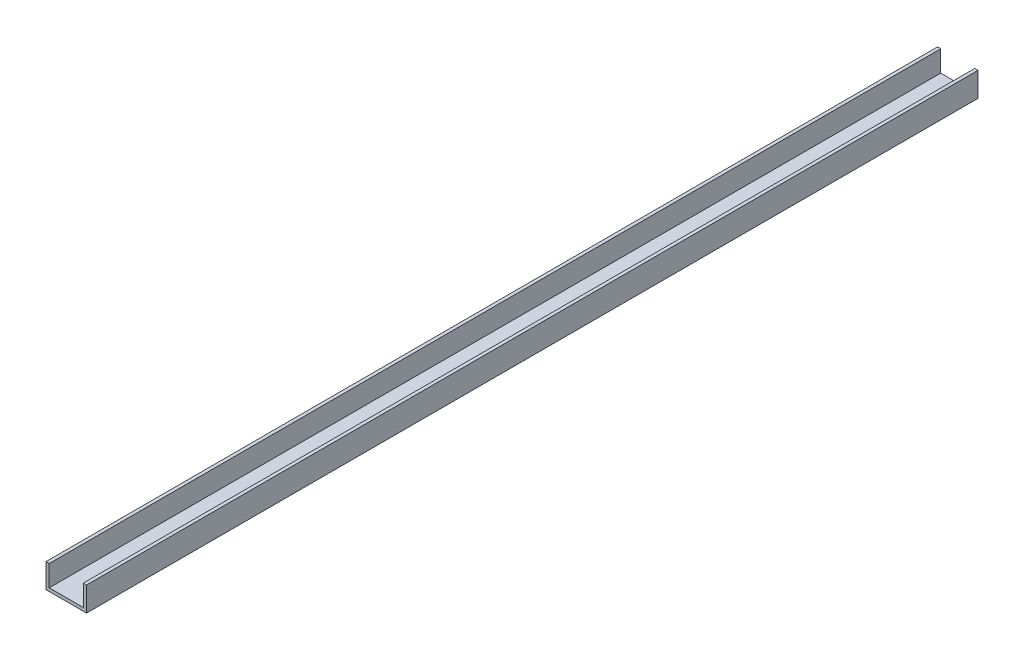
ISO-10303-21;
HEADER;
FILE_DESCRIPTION(('STEP AP214'),'2;1');
FILE_NAME('part.step','',(''),(''),'','','');
FILE_SCHEMA(('AUTOMOTIVE_DESIGN { 1 0 10303 214 1 1 1 1 }'));
ENDSEC;
DATA;
#1=APPLICATION_CONTEXT('core data for automotive mechanical design processes');
#2=APPLICATION_PROTOCOL_DEFINITION('international standard','automotive_design',2000,#1);
#3=PRODUCT_CONTEXT('',#1,'mechanical');
#4=PRODUCT('Part','Part','',(#3));
#5=PRODUCT_RELATED_PRODUCT_CATEGORY('part','',(#4));
#6=PRODUCT_DEFINITION_FORMATION('','',#4);
#7=PRODUCT_DEFINITION_CONTEXT('part definition',#1,'design');
#8=PRODUCT_DEFINITION('design','',#6,#7);
#9=PRODUCT_DEFINITION_SHAPE('','',#8);
#10=(LENGTH_UNIT() NAMED_UNIT(*) SI_UNIT(.MILLI.,.METRE.));
#11=(NAMED_UNIT(*) PLANE_ANGLE_UNIT() SI_UNIT($,.RADIAN.));
#12=(NAMED_UNIT(*) SI_UNIT($,.STERADIAN.) SOLID_ANGLE_UNIT());
#13=UNCERTAINTY_MEASURE_WITH_UNIT(LENGTH_MEASURE(1.E-05),#10,'distance_accuracy_value','');
#14=(GEOMETRIC_REPRESENTATION_CONTEXT(3) GLOBAL_UNCERTAINTY_ASSIGNED_CONTEXT((#13)) GLOBAL_UNIT_ASSIGNED_CONTEXT((#10,
#11,#12)) REPRESENTATION_CONTEXT('',''));
#15=CARTESIAN_POINT('',(0.,0.,0.));
#16=DIRECTION('',(0.,0.,1.));
#17=DIRECTION('',(1.,0.,0.));
#18=AXIS2_PLACEMENT_3D('',#15,#16,#17);
#19=CARTESIAN_POINT('',(12.5,0.,550.));
#20=DIRECTION('',(-1.,0.,0.));
#21=DIRECTION('',(0.,0.,1.));
#22=AXIS2_PLACEMENT_3D('',#19,#20,#21);
#23=PLANE('',#22);
#24=DIRECTION('',(0.,1.,0.));
#25=VECTOR('',#24,1.);
#26=CARTESIAN_POINT('',(12.5,0.,0.));
#27=LINE('',#26,#25);
#28=CARTESIAN_POINT('',(12.5,0.,0.));
#29=VERTEX_POINT('',#28);
#30=CARTESIAN_POINT('',(12.5,15.,0.));
#31=VERTEX_POINT('',#30);
#32=EDGE_CURVE('E129',#29,#31,#27,.T.);
#33=ORIENTED_EDGE('',*,*,#32,.T.);
#34=DIRECTION('',(0.,0.,-1.));
#35=VECTOR('',#34,1.);
#36=CARTESIAN_POINT('',(12.5,15.,550.));
#37=LINE('',#36,#35);
#38=CARTESIAN_POINT('',(12.5,15.,550.));
#39=VERTEX_POINT('',#38);
#40=EDGE_CURVE('E11',#39,#31,#37,.T.);
#41=ORIENTED_EDGE('',*,*,#40,.F.);
#42=DIRECTION('',(0.,1.,0.));
#43=VECTOR('',#42,1.);
#44=CARTESIAN_POINT('',(12.5,0.,550.));
#45=LINE('',#44,#43);
#46=CARTESIAN_POINT('',(12.5,0.,550.));
#47=VERTEX_POINT('',#46);
#48=EDGE_CURVE('E143',#47,#39,#45,.T.);
#49=ORIENTED_EDGE('',*,*,#48,.F.);
#50=DIRECTION('',(0.,0.,-1.));
#51=VECTOR('',#50,1.);
#52=CARTESIAN_POINT('',(12.5,0.,550.));
#53=LINE('',#52,#51);
#54=EDGE_CURVE('E125',#47,#29,#53,.T.);
#55=ORIENTED_EDGE('',*,*,#54,.T.);
#56=EDGE_LOOP('',(#33,#41,#49,#55));
#57=FACE_BOUND('',#56,.T.);
#58=ADVANCED_FACE('F33',(#57),#23,.F.);
#59=CARTESIAN_POINT('',(12.5,15.,550.));
#60=DIRECTION('',(0.,-1.,0.));
#61=DIRECTION('',(1.,0.,0.));
#62=AXIS2_PLACEMENT_3D('',#59,#60,#61);
#63=PLANE('',#62);
#64=DIRECTION('',(-1.,0.,0.));
#65=VECTOR('',#64,1.);
#66=CARTESIAN_POINT('',(12.5,15.,0.));
#67=LINE('',#66,#65);
#68=CARTESIAN_POINT('',(10.5,15.,0.));
#69=VERTEX_POINT('',#68);
#70=EDGE_CURVE('E132',#31,#69,#67,.T.);
#71=ORIENTED_EDGE('',*,*,#70,.T.);
#72=DIRECTION('',(0.,0.,-1.));
#73=VECTOR('',#72,1.);
#74=CARTESIAN_POINT('',(10.5,15.,550.));
#75=LINE('',#74,#73);
#76=CARTESIAN_POINT('',(10.5,15.,550.));
#77=VERTEX_POINT('',#76);
#78=EDGE_CURVE('E41',#77,#69,#75,.T.);
#79=ORIENTED_EDGE('',*,*,#78,.F.);
#80=DIRECTION('',(-1.,0.,0.));
#81=VECTOR('',#80,1.);
#82=CARTESIAN_POINT('',(12.5,15.,550.));
#83=LINE('',#82,#81);
#84=EDGE_CURVE('E92',#39,#77,#83,.T.);
#85=ORIENTED_EDGE('',*,*,#84,.F.);
#86=ORIENTED_EDGE('',*,*,#40,.T.);
#87=EDGE_LOOP('',(#71,#79,#85,#86));
#88=FACE_BOUND('',#87,.T.);
#89=ADVANCED_FACE('F178',(#88),#63,.F.);
#90=CARTESIAN_POINT('',(10.5,15.,550.));
#91=DIRECTION('',(1.,0.,0.));
#92=DIRECTION('',(0.,1.,0.));
#93=AXIS2_PLACEMENT_3D('',#90,#91,#92);
#94=PLANE('',#93);
#95=DIRECTION('',(0.,-1.,0.));
#96=VECTOR('',#95,1.);
#97=CARTESIAN_POINT('',(10.5,15.,0.));
#98=LINE('',#97,#96);
#99=CARTESIAN_POINT('',(10.5,2.,0.));
#100=VERTEX_POINT('',#99);
#101=EDGE_CURVE('E134',#69,#100,#98,.T.);
#102=ORIENTED_EDGE('',*,*,#101,.T.);
#103=DIRECTION('',(0.,0.,-1.));
#104=VECTOR('',#103,1.);
#105=CARTESIAN_POINT('',(10.5,2.,550.));
#106=LINE('',#105,#104);
#107=CARTESIAN_POINT('',(10.5,2.,550.));
#108=VERTEX_POINT('',#107);
#109=EDGE_CURVE('E150',#108,#100,#106,.T.);
#110=ORIENTED_EDGE('',*,*,#109,.F.);
#111=DIRECTION('',(0.,-1.,0.));
#112=VECTOR('',#111,1.);
#113=CARTESIAN_POINT('',(10.5,15.,550.));
#114=LINE('',#113,#112);
#115=EDGE_CURVE('E158',#77,#108,#114,.T.);
#116=ORIENTED_EDGE('',*,*,#115,.F.);
#117=ORIENTED_EDGE('',*,*,#78,.T.);
#118=EDGE_LOOP('',(#102,#110,#116,#117));
#119=FACE_BOUND('',#118,.T.);
#120=ADVANCED_FACE('F156',(#119),#94,.F.);
#121=CARTESIAN_POINT('',(10.5,2.,550.));
#122=DIRECTION('',(0.,-1.,0.));
#123=DIRECTION('',(1.,0.,0.));
#124=AXIS2_PLACEMENT_3D('',#121,#122,#123);
#125=PLANE('',#124);
#126=DIRECTION('',(-1.,0.,0.));
#127=VECTOR('',#126,1.);
#128=CARTESIAN_POINT('',(10.5,2.,0.));
#129=LINE('',#128,#127);
#130=CARTESIAN_POINT('',(-10.5,2.,0.));
#131=VERTEX_POINT('',#130);
#132=EDGE_CURVE('E136',#100,#131,#129,.T.);
#133=ORIENTED_EDGE('',*,*,#132,.T.);
#134=DIRECTION('',(0.,0.,-1.));
#135=VECTOR('',#134,1.);
#136=CARTESIAN_POINT('',(-10.5,2.,550.));
#137=LINE('',#136,#135);
#138=CARTESIAN_POINT('',(-10.5,2.,550.));
#139=VERTEX_POINT('',#138);
#140=EDGE_CURVE('E147',#139,#131,#137,.T.);
#141=ORIENTED_EDGE('',*,*,#140,.F.);
#142=DIRECTION('',(-1.,0.,0.));
#143=VECTOR('',#142,1.);
#144=CARTESIAN_POINT('',(10.5,2.,550.));
#145=LINE('',#144,#143);
#146=EDGE_CURVE('E170',#108,#139,#145,.T.);
#147=ORIENTED_EDGE('',*,*,#146,.F.);
#148=ORIENTED_EDGE('',*,*,#109,.T.);
#149=EDGE_LOOP('',(#133,#141,#147,#148));
#150=FACE_BOUND('',#149,.T.);
#151=ADVANCED_FACE('F166',(#150),#125,.F.);
#152=CARTESIAN_POINT('',(-10.5,15.,550.));
#153=DIRECTION('',(-1.,0.,0.));
#154=DIRECTION('',(0.,-1.,0.));
#155=AXIS2_PLACEMENT_3D('',#152,#153,#154);
#156=PLANE('',#155);
#157=DIRECTION('',(0.,1.,0.));
#158=VECTOR('',#157,1.);
#159=CARTESIAN_POINT('',(-10.5,15.,0.));
#160=LINE('',#159,#158);
#161=CARTESIAN_POINT('',(-10.5,15.,0.));
#162=VERTEX_POINT('',#161);
#163=EDGE_CURVE('E138',#131,#162,#160,.T.);
#164=ORIENTED_EDGE('',*,*,#163,.T.);
#165=DIRECTION('',(0.,0.,-1.));
#166=VECTOR('',#165,1.);
#167=CARTESIAN_POINT('',(-10.5,15.,550.));
#168=LINE('',#167,#166);
#169=CARTESIAN_POINT('',(-10.5,15.,550.));
#170=VERTEX_POINT('',#169);
#171=EDGE_CURVE('E120',#170,#162,#168,.T.);
#172=ORIENTED_EDGE('',*,*,#171,.F.);
#173=DIRECTION('',(0.,1.,0.));
#174=VECTOR('',#173,1.);
#175=CARTESIAN_POINT('',(-10.5,15.,550.));
#176=LINE('',#175,#174);
#177=EDGE_CURVE('E111',#139,#170,#176,.T.);
#178=ORIENTED_EDGE('',*,*,#177,.F.);
#179=ORIENTED_EDGE('',*,*,#140,.T.);
#180=EDGE_LOOP('',(#164,#172,#178,#179));
#181=FACE_BOUND('',#180,.T.);
#182=ADVANCED_FACE('F169',(#181),#156,.F.);
#183=CARTESIAN_POINT('',(-12.5,15.,550.));
#184=DIRECTION('',(0.,-1.,0.));
#185=DIRECTION('',(0.,0.,-1.));
#186=AXIS2_PLACEMENT_3D('',#183,#184,#185);
#187=PLANE('',#186);
#188=DIRECTION('',(-1.,0.,0.));
#189=VECTOR('',#188,1.);
#190=CARTESIAN_POINT('',(-12.5,15.,0.));
#191=LINE('',#190,#189);
#192=CARTESIAN_POINT('',(-12.5,15.,0.));
#193=VERTEX_POINT('',#192);
#194=EDGE_CURVE('E119',#162,#193,#191,.T.);
#195=ORIENTED_EDGE('',*,*,#194,.T.);
#196=DIRECTION('',(0.,0.,-1.));
#197=VECTOR('',#196,1.);
#198=CARTESIAN_POINT('',(-12.5,15.,550.));
#199=LINE('',#198,#197);
#200=CARTESIAN_POINT('',(-12.5,15.,550.));
#201=VERTEX_POINT('',#200);
#202=EDGE_CURVE('E116',#201,#193,#199,.T.);
#203=ORIENTED_EDGE('',*,*,#202,.F.);
#204=DIRECTION('',(-1.,0.,0.));
#205=VECTOR('',#204,1.);
#206=CARTESIAN_POINT('',(-12.5,15.,550.));
#207=LINE('',#206,#205);
#208=EDGE_CURVE('E105',#170,#201,#207,.T.);
#209=ORIENTED_EDGE('',*,*,#208,.F.);
#210=ORIENTED_EDGE('',*,*,#171,.T.);
#211=EDGE_LOOP('',(#195,#203,#209,#210));
#212=FACE_BOUND('',#211,.T.);
#213=ADVANCED_FACE('F117',(#212),#187,.F.);
#214=CARTESIAN_POINT('',(-12.5,0.,550.));
#215=DIRECTION('',(1.,0.,0.));
#216=DIRECTION('',(0.,1.,0.));
#217=AXIS2_PLACEMENT_3D('',#214,#215,#216);
#218=PLANE('',#217);
#219=DIRECTION('',(0.,-1.,0.));
#220=VECTOR('',#219,1.);
#221=CARTESIAN_POINT('',(-12.5,0.,0.));
#222=LINE('',#221,#220);
#223=CARTESIAN_POINT('',(-12.5,0.,0.));
#224=VERTEX_POINT('',#223);
#225=EDGE_CURVE('E78',#193,#224,#222,.T.);
#226=ORIENTED_EDGE('',*,*,#225,.T.);
#227=DIRECTION('',(0.,0.,-1.));
#228=VECTOR('',#227,1.);
#229=CARTESIAN_POINT('',(-12.5,0.,550.));
#230=LINE('',#229,#228);
#231=CARTESIAN_POINT('',(-12.5,0.,550.));
#232=VERTEX_POINT('',#231);
#233=EDGE_CURVE('E121',#232,#224,#230,.T.);
#234=ORIENTED_EDGE('',*,*,#233,.F.);
#235=DIRECTION('',(0.,-1.,0.));
#236=VECTOR('',#235,1.);
#237=CARTESIAN_POINT('',(-12.5,0.,550.));
#238=LINE('',#237,#236);
#239=EDGE_CURVE('E109',#201,#232,#238,.T.);
#240=ORIENTED_EDGE('',*,*,#239,.F.);
#241=ORIENTED_EDGE('',*,*,#202,.T.);
#242=EDGE_LOOP('',(#226,#234,#240,#241));
#243=FACE_BOUND('',#242,.T.);
#244=ADVANCED_FACE('F123',(#243),#218,.F.);
#245=CARTESIAN_POINT('',(-12.5,0.,550.));
#246=DIRECTION('',(0.,1.,0.));
#247=DIRECTION('',(-1.,0.,0.));
#248=AXIS2_PLACEMENT_3D('',#245,#246,#247);
#249=PLANE('',#248);
#250=DIRECTION('',(1.,0.,0.));
#251=VECTOR('',#250,1.);
#252=CARTESIAN_POINT('',(-12.5,0.,0.));
#253=LINE('',#252,#251);
#254=EDGE_CURVE('E84',#224,#29,#253,.T.);
#255=ORIENTED_EDGE('',*,*,#254,.T.);
#256=ORIENTED_EDGE('',*,*,#54,.F.);
#257=DIRECTION('',(1.,0.,0.));
#258=VECTOR('',#257,1.);
#259=CARTESIAN_POINT('',(-12.5,0.,550.));
#260=LINE('',#259,#258);
#261=EDGE_CURVE('E49',#232,#47,#260,.T.);
#262=ORIENTED_EDGE('',*,*,#261,.F.);
#263=ORIENTED_EDGE('',*,*,#233,.T.);
#264=EDGE_LOOP('',(#255,#256,#262,#263));
#265=FACE_BOUND('',#264,.T.);
#266=ADVANCED_FACE('F194',(#265),#249,.F.);
#267=CARTESIAN_POINT('',(0.,0.,550.));
#268=DIRECTION('',(0.,0.,1.));
#269=DIRECTION('',(1.,0.,0.));
#270=AXIS2_PLACEMENT_3D('',#267,#268,#269);
#271=PLANE('',#270);
#272=ORIENTED_EDGE('',*,*,#48,.T.);
#273=ORIENTED_EDGE('',*,*,#84,.T.);
#274=ORIENTED_EDGE('',*,*,#115,.T.);
#275=ORIENTED_EDGE('',*,*,#146,.T.);
#276=ORIENTED_EDGE('',*,*,#177,.T.);
#277=ORIENTED_EDGE('',*,*,#208,.T.);
#278=ORIENTED_EDGE('',*,*,#239,.T.);
#279=ORIENTED_EDGE('',*,*,#261,.T.);
#280=EDGE_LOOP('',(#272,#273,#274,#275,#276,#277,#278,#279));
#281=FACE_BOUND('',#280,.T.);
#282=ADVANCED_FACE('F107',(#281),#271,.T.);
#283=CARTESIAN_POINT('',(0.,0.,0.));
#284=DIRECTION('',(0.,0.,1.));
#285=DIRECTION('',(1.,0.,0.));
#286=AXIS2_PLACEMENT_3D('',#283,#284,#285);
#287=PLANE('',#286);
#288=ORIENTED_EDGE('',*,*,#32,.F.);
#289=ORIENTED_EDGE('',*,*,#254,.F.);
#290=ORIENTED_EDGE('',*,*,#225,.F.);
#291=ORIENTED_EDGE('',*,*,#194,.F.);
#292=ORIENTED_EDGE('',*,*,#163,.F.);
#293=ORIENTED_EDGE('',*,*,#132,.F.);
#294=ORIENTED_EDGE('',*,*,#101,.F.);
#295=ORIENTED_EDGE('',*,*,#70,.F.);
#296=EDGE_LOOP('',(#288,#289,#290,#291,#292,#293,#294,#295));
#297=FACE_BOUND('',#296,.T.);
#298=ADVANCED_FACE('F162',(#297),#287,.F.);
#299=CLOSED_SHELL('',(#58,#89,#120,#151,#182,#213,#244,#266,#282,#298));
#300=MANIFOLD_SOLID_BREP('B2',#299);
#301=ADVANCED_BREP_SHAPE_REPRESENTATION('',(#18,#300),#14);
#302=SHAPE_DEFINITION_REPRESENTATION(#9,#301);
ENDSEC;
END-ISO-10303-21;
